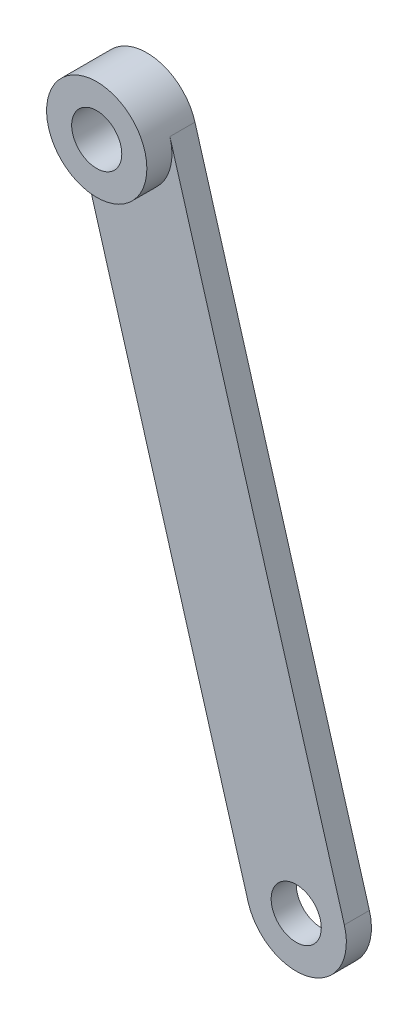
ISO-10303-21;
HEADER;
FILE_DESCRIPTION(('STEP AP214'),'2;1');
FILE_NAME('part.step','',(''),(''),'','','');
FILE_SCHEMA(('AUTOMOTIVE_DESIGN { 1 0 10303 214 1 1 1 1 }'));
ENDSEC;
DATA;
#1=APPLICATION_CONTEXT('core data for automotive mechanical design processes');
#2=APPLICATION_PROTOCOL_DEFINITION('international standard','automotive_design',2000,#1);
#3=PRODUCT_CONTEXT('',#1,'mechanical');
#4=PRODUCT('Part','Part','',(#3));
#5=PRODUCT_RELATED_PRODUCT_CATEGORY('part','',(#4));
#6=PRODUCT_DEFINITION_FORMATION('','',#4);
#7=PRODUCT_DEFINITION_CONTEXT('part definition',#1,'design');
#8=PRODUCT_DEFINITION('design','',#6,#7);
#9=PRODUCT_DEFINITION_SHAPE('','',#8);
#10=(LENGTH_UNIT() NAMED_UNIT(*) SI_UNIT(.MILLI.,.METRE.));
#11=(NAMED_UNIT(*) PLANE_ANGLE_UNIT() SI_UNIT($,.RADIAN.));
#12=(NAMED_UNIT(*) SI_UNIT($,.STERADIAN.) SOLID_ANGLE_UNIT());
#13=UNCERTAINTY_MEASURE_WITH_UNIT(LENGTH_MEASURE(1.E-05),#10,'distance_accuracy_value','');
#14=(GEOMETRIC_REPRESENTATION_CONTEXT(3) GLOBAL_UNCERTAINTY_ASSIGNED_CONTEXT((#13)) GLOBAL_UNIT_ASSIGNED_CONTEXT((#10,
#11,#12)) REPRESENTATION_CONTEXT('',''));
#15=CARTESIAN_POINT('',(0.,0.,0.));
#16=DIRECTION('',(0.,0.,1.));
#17=DIRECTION('',(1.,0.,0.));
#18=AXIS2_PLACEMENT_3D('',#15,#16,#17);
#19=CARTESIAN_POINT('',(-38.,-7.80000000000001,1.5875));
#20=DIRECTION('',(0.,0.,1.));
#21=DIRECTION('',(1.,0.,0.));
#22=AXIS2_PLACEMENT_3D('',#19,#20,#21);
#23=PLANE('',#22);
#24=CARTESIAN_POINT('',(-38.,-7.80000000000001,1.5875));
#25=DIRECTION('',(0.,0.,1.));
#26=DIRECTION('',(1.,0.,0.));
#27=AXIS2_PLACEMENT_3D('',#24,#25,#26);
#28=CIRCLE('',#27,3.17500000000002);
#29=CARTESIAN_POINT('',(-41.0469634933844,-8.69254606042637,1.5875));
#30=VERTEX_POINT('',#29);
#31=CARTESIAN_POINT('',(-34.9530365066156,-6.90745393957364,1.5875));
#32=VERTEX_POINT('',#31);
#33=EDGE_CURVE('E11',#30,#32,#28,.T.);
#34=ORIENTED_EDGE('',*,*,#33,.F.);
#35=DIRECTION('',(0.281116869425626,-0.959673541223439,0.));
#36=VECTOR('',#35,1.);
#37=CARTESIAN_POINT('',(-41.0469634933844,-8.69254606042637,1.5875));
#38=LINE('',#37,#36);
#39=CARTESIAN_POINT('',(-29.9990705249573,-46.4077162305075,1.5875));
#40=VERTEX_POINT('',#39);
#41=EDGE_CURVE('E103',#30,#40,#38,.T.);
#42=ORIENTED_EDGE('',*,*,#41,.T.);
#43=CARTESIAN_POINT('',(-26.9521070315729,-45.5151701700811,1.5875));
#44=DIRECTION('',(0.,0.,1.));
#45=DIRECTION('',(1.,0.,0.));
#46=AXIS2_PLACEMENT_3D('',#43,#44,#45);
#47=CIRCLE('',#46,3.17500000000001);
#48=CARTESIAN_POINT('',(-23.9051435381885,-44.6226241096548,1.5875));
#49=VERTEX_POINT('',#48);
#50=EDGE_CURVE('E54',#40,#49,#47,.T.);
#51=ORIENTED_EDGE('',*,*,#50,.T.);
#52=DIRECTION('',(-0.281116869425626,0.959673541223439,0.));
#53=VECTOR('',#52,1.);
#54=CARTESIAN_POINT('',(-34.9530365066156,-6.90745393957364,1.5875));
#55=LINE('',#54,#53);
#56=EDGE_CURVE('E85',#49,#32,#55,.T.);
#57=ORIENTED_EDGE('',*,*,#56,.T.);
#58=EDGE_LOOP('',(#34,#42,#51,#57));
#59=FACE_BOUND('',#58,.T.);
#60=CARTESIAN_POINT('',(-26.9521070315729,-45.5151701700811,1.5875));
#61=DIRECTION('',(0.,0.,1.));
#62=DIRECTION('',(1.,0.,0.));
#63=AXIS2_PLACEMENT_3D('',#60,#61,#62);
#64=CIRCLE('',#63,1.5875);
#65=CARTESIAN_POINT('',(-25.3646070315729,-45.5151701700811,1.5875));
#66=VERTEX_POINT('',#65);
#67=EDGE_CURVE('E117',#66,#66,#64,.T.);
#68=ORIENTED_EDGE('',*,*,#67,.F.);
#69=EDGE_LOOP('',(#68));
#70=FACE_BOUND('',#69,.T.);
#71=ADVANCED_FACE('F35',(#59,#70),#23,.T.);
#72=CARTESIAN_POINT('',(-38.,-7.80000000000001,0.));
#73=DIRECTION('',(0.,0.,1.));
#74=DIRECTION('',(1.,0.,0.));
#75=AXIS2_PLACEMENT_3D('',#72,#73,#74);
#76=PLANE('',#75);
#77=CARTESIAN_POINT('',(-26.9521070315729,-45.5151701700811,0.));
#78=DIRECTION('',(0.,0.,1.));
#79=DIRECTION('',(1.,0.,0.));
#80=AXIS2_PLACEMENT_3D('',#77,#78,#79);
#81=CIRCLE('',#80,1.5875);
#82=CARTESIAN_POINT('',(-25.3646070315729,-45.5151701700811,0.));
#83=VERTEX_POINT('',#82);
#84=EDGE_CURVE('E119',#83,#83,#81,.T.);
#85=ORIENTED_EDGE('',*,*,#84,.T.);
#86=EDGE_LOOP('',(#85));
#87=FACE_BOUND('',#86,.T.);
#88=CARTESIAN_POINT('',(-38.,-7.80000000000001,0.));
#89=DIRECTION('',(0.,0.,1.));
#90=DIRECTION('',(1.,0.,0.));
#91=AXIS2_PLACEMENT_3D('',#88,#89,#90);
#92=CIRCLE('',#91,3.17500000000002);
#93=CARTESIAN_POINT('',(-34.9530365066156,-6.90745393957364,0.));
#94=VERTEX_POINT('',#93);
#95=CARTESIAN_POINT('',(-41.0469634933844,-8.69254606042637,0.));
#96=VERTEX_POINT('',#95);
#97=EDGE_CURVE('E96',#94,#96,#92,.T.);
#98=ORIENTED_EDGE('',*,*,#97,.F.);
#99=DIRECTION('',(-0.281116869425626,0.959673541223439,0.));
#100=VECTOR('',#99,1.);
#101=CARTESIAN_POINT('',(-34.9530365066156,-6.90745393957364,0.));
#102=LINE('',#101,#100);
#103=CARTESIAN_POINT('',(-23.9051435381885,-44.6226241096548,0.));
#104=VERTEX_POINT('',#103);
#105=EDGE_CURVE('E77',#104,#94,#102,.T.);
#106=ORIENTED_EDGE('',*,*,#105,.F.);
#107=CARTESIAN_POINT('',(-26.9521070315729,-45.5151701700811,0.));
#108=DIRECTION('',(0.,0.,1.));
#109=DIRECTION('',(1.,0.,0.));
#110=AXIS2_PLACEMENT_3D('',#107,#108,#109);
#111=CIRCLE('',#110,3.17500000000001);
#112=CARTESIAN_POINT('',(-29.9990705249573,-46.4077162305075,0.));
#113=VERTEX_POINT('',#112);
#114=EDGE_CURVE('E71',#113,#104,#111,.T.);
#115=ORIENTED_EDGE('',*,*,#114,.F.);
#116=DIRECTION('',(0.281116869425626,-0.959673541223439,0.));
#117=VECTOR('',#116,1.);
#118=CARTESIAN_POINT('',(-41.0469634933844,-8.69254606042637,0.));
#119=LINE('',#118,#117);
#120=EDGE_CURVE('E114',#96,#113,#119,.T.);
#121=ORIENTED_EDGE('',*,*,#120,.F.);
#122=EDGE_LOOP('',(#98,#106,#115,#121));
#123=FACE_BOUND('',#122,.T.);
#124=CARTESIAN_POINT('',(-38.,-7.8,0.));
#125=DIRECTION('',(0.,0.,1.));
#126=DIRECTION('',(1.,0.,0.));
#127=AXIS2_PLACEMENT_3D('',#124,#125,#126);
#128=CIRCLE('',#127,1.5875);
#129=CARTESIAN_POINT('',(-36.4125,-7.8,0.));
#130=VERTEX_POINT('',#129);
#131=EDGE_CURVE('E122',#130,#130,#128,.T.);
#132=ORIENTED_EDGE('',*,*,#131,.T.);
#133=EDGE_LOOP('',(#132));
#134=FACE_BOUND('',#133,.T.);
#135=ADVANCED_FACE('F147',(#87,#123,#134),#76,.F.);
#136=CARTESIAN_POINT('',(-38.,-7.80000000000001,1.5875));
#137=DIRECTION('',(0.,0.,-1.));
#138=DIRECTION('',(-1.,0.,0.));
#139=AXIS2_PLACEMENT_3D('',#136,#137,#138);
#140=CYLINDRICAL_SURFACE('',#139,3.17500000000002);
#141=ORIENTED_EDGE('',*,*,#97,.T.);
#142=DIRECTION('',(0.,0.,-1.));
#143=VECTOR('',#142,1.);
#144=CARTESIAN_POINT('',(-41.0469634933844,-8.69254606042637,1.5875));
#145=LINE('',#144,#143);
#146=EDGE_CURVE('E45',#30,#96,#145,.T.);
#147=ORIENTED_EDGE('',*,*,#146,.F.);
#148=ORIENTED_EDGE('',*,*,#33,.T.);
#149=DIRECTION('',(0.,0.,-1.));
#150=VECTOR('',#149,1.);
#151=CARTESIAN_POINT('',(-34.9530365066156,-6.90745393957364,1.5875));
#152=LINE('',#151,#150);
#153=EDGE_CURVE('E83',#32,#94,#152,.T.);
#154=ORIENTED_EDGE('',*,*,#153,.T.);
#155=EDGE_LOOP('',(#141,#147,#148,#154));
#156=FACE_BOUND('',#155,.T.);
#157=CARTESIAN_POINT('',(-38.,-7.80000000000001,3.175));
#158=DIRECTION('',(0.,0.,1.));
#159=DIRECTION('',(1.,0.,0.));
#160=AXIS2_PLACEMENT_3D('',#157,#158,#159);
#161=CIRCLE('',#160,3.17500000000002);
#162=CARTESIAN_POINT('',(-34.825,-7.80000000000001,3.175));
#163=VERTEX_POINT('',#162);
#164=EDGE_CURVE('E127',#163,#163,#161,.T.);
#165=ORIENTED_EDGE('',*,*,#164,.F.);
#166=EDGE_LOOP('',(#165));
#167=FACE_BOUND('',#166,.T.);
#168=ADVANCED_FACE('F37',(#156,#167),#140,.T.);
#169=CARTESIAN_POINT('',(-41.0469634933844,-8.69254606042637,1.5875));
#170=DIRECTION('',(0.959673541223439,0.281116869425626,0.));
#171=DIRECTION('',(-0.281116869425626,0.959673541223439,0.));
#172=AXIS2_PLACEMENT_3D('',#169,#170,#171);
#173=PLANE('',#172);
#174=ORIENTED_EDGE('',*,*,#120,.T.);
#175=DIRECTION('',(0.,0.,-1.));
#176=VECTOR('',#175,1.);
#177=CARTESIAN_POINT('',(-29.9990705249573,-46.4077162305075,1.5875));
#178=LINE('',#177,#176);
#179=EDGE_CURVE('E98',#40,#113,#178,.T.);
#180=ORIENTED_EDGE('',*,*,#179,.F.);
#181=ORIENTED_EDGE('',*,*,#41,.F.);
#182=ORIENTED_EDGE('',*,*,#146,.T.);
#183=EDGE_LOOP('',(#174,#180,#181,#182));
#184=FACE_BOUND('',#183,.T.);
#185=ADVANCED_FACE('F162',(#184),#173,.F.);
#186=CARTESIAN_POINT('',(-26.9521070315729,-45.5151701700811,1.5875));
#187=DIRECTION('',(0.,0.,-1.));
#188=DIRECTION('',(-1.,0.,0.));
#189=AXIS2_PLACEMENT_3D('',#186,#187,#188);
#190=CYLINDRICAL_SURFACE('',#189,3.17500000000001);
#191=ORIENTED_EDGE('',*,*,#114,.T.);
#192=DIRECTION('',(0.,0.,-1.));
#193=VECTOR('',#192,1.);
#194=CARTESIAN_POINT('',(-23.9051435381885,-44.6226241096548,1.5875));
#195=LINE('',#194,#193);
#196=EDGE_CURVE('E89',#49,#104,#195,.T.);
#197=ORIENTED_EDGE('',*,*,#196,.F.);
#198=ORIENTED_EDGE('',*,*,#50,.F.);
#199=ORIENTED_EDGE('',*,*,#179,.T.);
#200=EDGE_LOOP('',(#191,#197,#198,#199));
#201=FACE_BOUND('',#200,.T.);
#202=ADVANCED_FACE('F160',(#201),#190,.T.);
#203=CARTESIAN_POINT('',(-34.9530365066156,-6.90745393957364,1.5875));
#204=DIRECTION('',(-0.959673541223439,-0.281116869425626,0.));
#205=DIRECTION('',(0.281116869425626,-0.959673541223439,0.));
#206=AXIS2_PLACEMENT_3D('',#203,#204,#205);
#207=PLANE('',#206);
#208=ORIENTED_EDGE('',*,*,#105,.T.);
#209=ORIENTED_EDGE('',*,*,#153,.F.);
#210=ORIENTED_EDGE('',*,*,#56,.F.);
#211=ORIENTED_EDGE('',*,*,#196,.T.);
#212=EDGE_LOOP('',(#208,#209,#210,#211));
#213=FACE_BOUND('',#212,.T.);
#214=ADVANCED_FACE('F84',(#213),#207,.F.);
#215=CARTESIAN_POINT('',(-26.9521070315729,-45.5151701700811,1.5875));
#216=DIRECTION('',(0.,0.,-1.));
#217=DIRECTION('',(-1.,0.,0.));
#218=AXIS2_PLACEMENT_3D('',#215,#216,#217);
#219=CYLINDRICAL_SURFACE('',#218,1.5875);
#220=ORIENTED_EDGE('',*,*,#67,.T.);
#221=EDGE_LOOP('',(#220));
#222=FACE_BOUND('',#221,.T.);
#223=ORIENTED_EDGE('',*,*,#84,.F.);
#224=EDGE_LOOP('',(#223));
#225=FACE_BOUND('',#224,.T.);
#226=ADVANCED_FACE('F143',(#222,#225),#219,.F.);
#227=CARTESIAN_POINT('',(-38.,-7.8,1.5875));
#228=DIRECTION('',(0.,0.,-1.));
#229=DIRECTION('',(-1.,0.,0.));
#230=AXIS2_PLACEMENT_3D('',#227,#228,#229);
#231=CYLINDRICAL_SURFACE('',#230,1.5875);
#232=ORIENTED_EDGE('',*,*,#131,.F.);
#233=EDGE_LOOP('',(#232));
#234=FACE_BOUND('',#233,.T.);
#235=CARTESIAN_POINT('',(-38.,-7.80000000000001,3.175));
#236=DIRECTION('',(0.,0.,1.));
#237=DIRECTION('',(1.,0.,0.));
#238=AXIS2_PLACEMENT_3D('',#235,#236,#237);
#239=CIRCLE('',#238,1.5875);
#240=CARTESIAN_POINT('',(-36.4125,-7.80000000000001,3.175));
#241=VERTEX_POINT('',#240);
#242=EDGE_CURVE('E130',#241,#241,#239,.T.);
#243=ORIENTED_EDGE('',*,*,#242,.T.);
#244=EDGE_LOOP('',(#243));
#245=FACE_BOUND('',#244,.T.);
#246=ADVANCED_FACE('F134',(#234,#245),#231,.F.);
#247=CARTESIAN_POINT('',(-38.,-7.80000000000001,3.175));
#248=DIRECTION('',(0.,0.,1.));
#249=DIRECTION('',(1.,0.,0.));
#250=AXIS2_PLACEMENT_3D('',#247,#248,#249);
#251=PLANE('',#250);
#252=ORIENTED_EDGE('',*,*,#164,.T.);
#253=EDGE_LOOP('',(#252));
#254=FACE_BOUND('',#253,.T.);
#255=ORIENTED_EDGE('',*,*,#242,.F.);
#256=EDGE_LOOP('',(#255));
#257=FACE_BOUND('',#256,.T.);
#258=ADVANCED_FACE('F136',(#254,#257),#251,.T.);
#259=CLOSED_SHELL('',(#71,#135,#168,#185,#202,#214,#226,#246,#258));
#260=MANIFOLD_SOLID_BREP('B2',#259);
#261=ADVANCED_BREP_SHAPE_REPRESENTATION('',(#18,#260),#14);
#262=SHAPE_DEFINITION_REPRESENTATION(#9,#261);
ENDSEC;
END-ISO-10303-21;
